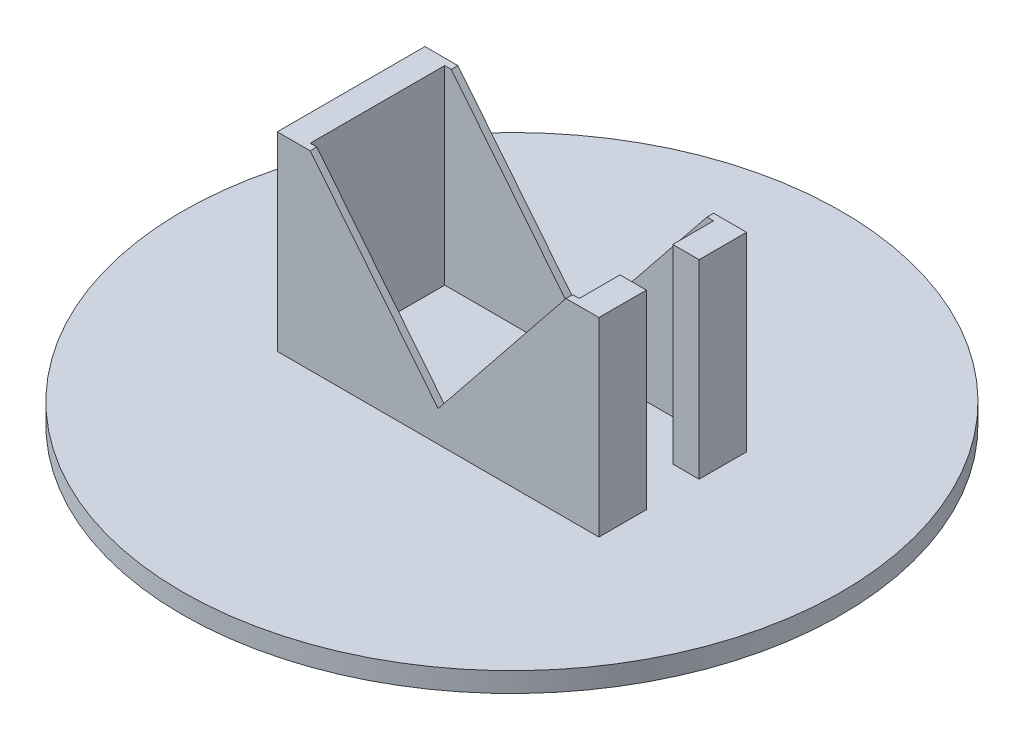
ISO-10303-21;
HEADER;
FILE_DESCRIPTION(('STEP AP214'),'2;1');
FILE_NAME('part.step','',(''),(''),'','','');
FILE_SCHEMA(('AUTOMOTIVE_DESIGN { 1 0 10303 214 1 1 1 1 }'));
ENDSEC;
DATA;
#1=APPLICATION_CONTEXT('core data for automotive mechanical design processes');
#2=APPLICATION_PROTOCOL_DEFINITION('international standard','automotive_design',2000,#1);
#3=PRODUCT_CONTEXT('',#1,'mechanical');
#4=PRODUCT('Part','Part','',(#3));
#5=PRODUCT_RELATED_PRODUCT_CATEGORY('part','',(#4));
#6=PRODUCT_DEFINITION_FORMATION('','',#4);
#7=PRODUCT_DEFINITION_CONTEXT('part definition',#1,'design');
#8=PRODUCT_DEFINITION('design','',#6,#7);
#9=PRODUCT_DEFINITION_SHAPE('','',#8);
#10=(LENGTH_UNIT() NAMED_UNIT(*) SI_UNIT(.MILLI.,.METRE.));
#11=(NAMED_UNIT(*) PLANE_ANGLE_UNIT() SI_UNIT($,.RADIAN.));
#12=(NAMED_UNIT(*) SI_UNIT($,.STERADIAN.) SOLID_ANGLE_UNIT());
#13=UNCERTAINTY_MEASURE_WITH_UNIT(LENGTH_MEASURE(1.E-05),#10,'distance_accuracy_value','');
#14=(GEOMETRIC_REPRESENTATION_CONTEXT(3) GLOBAL_UNCERTAINTY_ASSIGNED_CONTEXT((#13)) GLOBAL_UNIT_ASSIGNED_CONTEXT((#10,
#11,#12)) REPRESENTATION_CONTEXT('',''));
#15=CARTESIAN_POINT('',(0.,0.,0.));
#16=DIRECTION('',(0.,0.,1.));
#17=DIRECTION('',(1.,0.,0.));
#18=AXIS2_PLACEMENT_3D('',#15,#16,#17);
#19=CARTESIAN_POINT('',(0.,31.85,0.));
#20=DIRECTION('',(0.,-1.,0.));
#21=DIRECTION('',(0.,0.,-1.));
#22=AXIS2_PLACEMENT_3D('',#19,#20,#21);
#23=PLANE('',#22);
#24=DIRECTION('',(-1.,0.,0.));
#25=VECTOR('',#24,1.);
#26=CARTESIAN_POINT('',(-20.4,31.85,10.2));
#27=LINE('',#26,#25);
#28=CARTESIAN_POINT('',(20.4,31.85,10.2));
#29=VERTEX_POINT('',#28);
#30=CARTESIAN_POINT('',(19.4,31.85,10.2));
#31=VERTEX_POINT('',#30);
#32=EDGE_CURVE('E201',#29,#31,#27,.T.);
#33=ORIENTED_EDGE('',*,*,#32,.T.);
#34=DIRECTION('',(0.,0.,1.));
#35=VECTOR('',#34,1.);
#36=CARTESIAN_POINT('',(19.4,31.85,0.));
#37=LINE('',#36,#35);
#38=CARTESIAN_POINT('',(19.4,31.85,11.2));
#39=VERTEX_POINT('',#38);
#40=EDGE_CURVE('E47',#31,#39,#37,.T.);
#41=ORIENTED_EDGE('',*,*,#40,.T.);
#42=DIRECTION('',(1.,0.,0.));
#43=VECTOR('',#42,1.);
#44=CARTESIAN_POINT('',(-24.4,31.85,11.2));
#45=LINE('',#44,#43);
#46=CARTESIAN_POINT('',(24.4,31.85,11.2));
#47=VERTEX_POINT('',#46);
#48=EDGE_CURVE('E190',#39,#47,#45,.T.);
#49=ORIENTED_EDGE('',*,*,#48,.T.);
#50=DIRECTION('',(0.,0.,-1.));
#51=VECTOR('',#50,1.);
#52=CARTESIAN_POINT('',(24.4,31.85,11.2));
#53=LINE('',#52,#51);
#54=CARTESIAN_POINT('',(24.4,31.85,4.));
#55=VERTEX_POINT('',#54);
#56=EDGE_CURVE('E189',#47,#55,#53,.T.);
#57=ORIENTED_EDGE('',*,*,#56,.T.);
#58=DIRECTION('',(-1.,0.,0.));
#59=VECTOR('',#58,1.);
#60=CARTESIAN_POINT('',(20.4,31.85,4.));
#61=LINE('',#60,#59);
#62=CARTESIAN_POINT('',(20.4,31.85,4.));
#63=VERTEX_POINT('',#62);
#64=EDGE_CURVE('E192',#55,#63,#61,.T.);
#65=ORIENTED_EDGE('',*,*,#64,.T.);
#66=DIRECTION('',(0.,0.,1.));
#67=VECTOR('',#66,1.);
#68=CARTESIAN_POINT('',(20.4,31.85,10.2));
#69=LINE('',#68,#67);
#70=EDGE_CURVE('E198',#63,#29,#69,.T.);
#71=ORIENTED_EDGE('',*,*,#70,.T.);
#72=EDGE_LOOP('',(#33,#41,#49,#57,#65,#71));
#73=FACE_BOUND('',#72,.T.);
#74=ADVANCED_FACE('F43',(#73),#23,.F.);
#75=DIRECTION('',(-1.,0.,0.));
#76=VECTOR('',#75,1.);
#77=CARTESIAN_POINT('',(-24.4,31.85,-11.2));
#78=LINE('',#77,#76);
#79=CARTESIAN_POINT('',(24.4,31.85,-11.2));
#80=VERTEX_POINT('',#79);
#81=CARTESIAN_POINT('',(19.4,31.85,-11.2));
#82=VERTEX_POINT('',#81);
#83=EDGE_CURVE('E284',#80,#82,#78,.T.);
#84=ORIENTED_EDGE('',*,*,#83,.T.);
#85=CARTESIAN_POINT('',(19.4,31.85,-10.2));
#86=VERTEX_POINT('',#85);
#87=EDGE_CURVE('E11',#82,#86,#37,.T.);
#88=ORIENTED_EDGE('',*,*,#87,.T.);
#89=DIRECTION('',(1.,0.,0.));
#90=VECTOR('',#89,1.);
#91=CARTESIAN_POINT('',(-20.4,31.85,-10.2));
#92=LINE('',#91,#90);
#93=CARTESIAN_POINT('',(20.4,31.85,-10.2));
#94=VERTEX_POINT('',#93);
#95=EDGE_CURVE('E206',#86,#94,#92,.T.);
#96=ORIENTED_EDGE('',*,*,#95,.T.);
#97=DIRECTION('',(0.,0.,1.));
#98=VECTOR('',#97,1.);
#99=CARTESIAN_POINT('',(20.4,31.85,-4.));
#100=LINE('',#99,#98);
#101=CARTESIAN_POINT('',(20.4,31.85,-4.));
#102=VERTEX_POINT('',#101);
#103=EDGE_CURVE('E238',#94,#102,#100,.T.);
#104=ORIENTED_EDGE('',*,*,#103,.T.);
#105=DIRECTION('',(1.,0.,0.));
#106=VECTOR('',#105,1.);
#107=CARTESIAN_POINT('',(20.4,31.85,-4.));
#108=LINE('',#107,#106);
#109=CARTESIAN_POINT('',(24.4,31.85,-4.));
#110=VERTEX_POINT('',#109);
#111=EDGE_CURVE('E287',#102,#110,#108,.T.);
#112=ORIENTED_EDGE('',*,*,#111,.T.);
#113=DIRECTION('',(0.,0.,-1.));
#114=VECTOR('',#113,1.);
#115=CARTESIAN_POINT('',(24.4,31.85,-4.));
#116=LINE('',#115,#114);
#117=EDGE_CURVE('E285',#110,#80,#116,.T.);
#118=ORIENTED_EDGE('',*,*,#117,.T.);
#119=EDGE_LOOP('',(#84,#88,#96,#104,#112,#118));
#120=FACE_BOUND('',#119,.T.);
#121=ADVANCED_FACE('F348',(#120),#23,.F.);
#122=CARTESIAN_POINT('',(0.,3.,0.));
#123=DIRECTION('',(0.,1.,0.));
#124=DIRECTION('',(0.,0.,1.));
#125=AXIS2_PLACEMENT_3D('',#122,#123,#124);
#126=PLANE('',#125);
#127=CARTESIAN_POINT('',(0.,3.,0.));
#128=DIRECTION('',(0.,1.,0.));
#129=DIRECTION('',(0.,0.,1.));
#130=AXIS2_PLACEMENT_3D('',#127,#128,#129);
#131=CIRCLE('',#130,50.);
#132=CARTESIAN_POINT('',(0.,3.,50.));
#133=VERTEX_POINT('',#132);
#134=EDGE_CURVE('E272',#133,#133,#131,.T.);
#135=ORIENTED_EDGE('',*,*,#134,.T.);
#136=EDGE_LOOP('',(#135));
#137=FACE_BOUND('',#136,.T.);
#138=DIRECTION('',(1.,0.,0.));
#139=VECTOR('',#138,1.);
#140=CARTESIAN_POINT('',(20.4,3.,-4.));
#141=LINE('',#140,#139);
#142=CARTESIAN_POINT('',(20.4,3.,-4.));
#143=VERTEX_POINT('',#142);
#144=CARTESIAN_POINT('',(24.4,3.,-4.));
#145=VERTEX_POINT('',#144);
#146=EDGE_CURVE('E214',#143,#145,#141,.T.);
#147=ORIENTED_EDGE('',*,*,#146,.F.);
#148=DIRECTION('',(0.,0.,1.));
#149=VECTOR('',#148,1.);
#150=CARTESIAN_POINT('',(20.4,3.,-4.));
#151=LINE('',#150,#149);
#152=CARTESIAN_POINT('',(20.4,3.,-10.2));
#153=VERTEX_POINT('',#152);
#154=EDGE_CURVE('E211',#153,#143,#151,.T.);
#155=ORIENTED_EDGE('',*,*,#154,.F.);
#156=DIRECTION('',(1.,0.,0.));
#157=VECTOR('',#156,1.);
#158=CARTESIAN_POINT('',(-20.4,3.,-10.2));
#159=LINE('',#158,#157);
#160=CARTESIAN_POINT('',(-20.4,3.,-10.2));
#161=VERTEX_POINT('',#160);
#162=EDGE_CURVE('E236',#161,#153,#159,.T.);
#163=ORIENTED_EDGE('',*,*,#162,.F.);
#164=DIRECTION('',(0.,0.,-1.));
#165=VECTOR('',#164,1.);
#166=CARTESIAN_POINT('',(-20.4,3.,10.2));
#167=LINE('',#166,#165);
#168=CARTESIAN_POINT('',(-20.4,3.,10.2));
#169=VERTEX_POINT('',#168);
#170=EDGE_CURVE('E233',#169,#161,#167,.T.);
#171=ORIENTED_EDGE('',*,*,#170,.F.);
#172=DIRECTION('',(-1.,0.,0.));
#173=VECTOR('',#172,1.);
#174=CARTESIAN_POINT('',(-20.4,3.,10.2));
#175=LINE('',#174,#173);
#176=CARTESIAN_POINT('',(20.4,3.,10.2));
#177=VERTEX_POINT('',#176);
#178=EDGE_CURVE('E231',#177,#169,#175,.T.);
#179=ORIENTED_EDGE('',*,*,#178,.F.);
#180=DIRECTION('',(0.,0.,1.));
#181=VECTOR('',#180,1.);
#182=CARTESIAN_POINT('',(20.4,3.,10.2));
#183=LINE('',#182,#181);
#184=CARTESIAN_POINT('',(20.4,3.,4.));
#185=VERTEX_POINT('',#184);
#186=EDGE_CURVE('E229',#185,#177,#183,.T.);
#187=ORIENTED_EDGE('',*,*,#186,.F.);
#188=DIRECTION('',(-1.,0.,0.));
#189=VECTOR('',#188,1.);
#190=CARTESIAN_POINT('',(20.4,3.,4.));
#191=LINE('',#190,#189);
#192=CARTESIAN_POINT('',(24.4,3.,4.));
#193=VERTEX_POINT('',#192);
#194=EDGE_CURVE('E227',#193,#185,#191,.T.);
#195=ORIENTED_EDGE('',*,*,#194,.F.);
#196=DIRECTION('',(0.,0.,-1.));
#197=VECTOR('',#196,1.);
#198=CARTESIAN_POINT('',(24.4,3.,11.2));
#199=LINE('',#198,#197);
#200=CARTESIAN_POINT('',(24.4,3.,11.2));
#201=VERTEX_POINT('',#200);
#202=EDGE_CURVE('E225',#201,#193,#199,.T.);
#203=ORIENTED_EDGE('',*,*,#202,.F.);
#204=DIRECTION('',(1.,0.,0.));
#205=VECTOR('',#204,1.);
#206=CARTESIAN_POINT('',(-24.4,3.,11.2));
#207=LINE('',#206,#205);
#208=CARTESIAN_POINT('',(-24.4,3.,11.2));
#209=VERTEX_POINT('',#208);
#210=EDGE_CURVE('E223',#209,#201,#207,.T.);
#211=ORIENTED_EDGE('',*,*,#210,.F.);
#212=DIRECTION('',(0.,0.,1.));
#213=VECTOR('',#212,1.);
#214=CARTESIAN_POINT('',(-24.4,3.,11.2));
#215=LINE('',#214,#213);
#216=CARTESIAN_POINT('',(-24.4,3.,-11.2));
#217=VERTEX_POINT('',#216);
#218=EDGE_CURVE('E221',#217,#209,#215,.T.);
#219=ORIENTED_EDGE('',*,*,#218,.F.);
#220=DIRECTION('',(-1.,0.,0.));
#221=VECTOR('',#220,1.);
#222=CARTESIAN_POINT('',(-24.4,3.,-11.2));
#223=LINE('',#222,#221);
#224=CARTESIAN_POINT('',(24.4,3.,-11.2));
#225=VERTEX_POINT('',#224);
#226=EDGE_CURVE('E219',#225,#217,#223,.T.);
#227=ORIENTED_EDGE('',*,*,#226,.F.);
#228=DIRECTION('',(0.,0.,-1.));
#229=VECTOR('',#228,1.);
#230=CARTESIAN_POINT('',(24.4,3.,-4.));
#231=LINE('',#230,#229);
#232=EDGE_CURVE('E217',#145,#225,#231,.T.);
#233=ORIENTED_EDGE('',*,*,#232,.F.);
#234=EDGE_LOOP('',(#147,#155,#163,#171,#179,#187,#195,#203,#211,#219,#227,#233));
#235=FACE_BOUND('',#234,.T.);
#236=ADVANCED_FACE('F359',(#137,#235),#126,.T.);
#237=CARTESIAN_POINT('',(0.,3.,0.));
#238=DIRECTION('',(0.,-1.,0.));
#239=DIRECTION('',(0.,0.,-1.));
#240=AXIS2_PLACEMENT_3D('',#237,#238,#239);
#241=CYLINDRICAL_SURFACE('',#240,50.);
#242=ORIENTED_EDGE('',*,*,#134,.F.);
#243=EDGE_LOOP('',(#242));
#244=FACE_BOUND('',#243,.T.);
#245=CARTESIAN_POINT('',(0.,0.,0.));
#246=DIRECTION('',(0.,1.,0.));
#247=DIRECTION('',(0.,0.,1.));
#248=AXIS2_PLACEMENT_3D('',#245,#246,#247);
#249=CIRCLE('',#248,50.);
#250=CARTESIAN_POINT('',(0.,0.,50.));
#251=VERTEX_POINT('',#250);
#252=EDGE_CURVE('E271',#251,#251,#249,.T.);
#253=ORIENTED_EDGE('',*,*,#252,.T.);
#254=EDGE_LOOP('',(#253));
#255=FACE_BOUND('',#254,.T.);
#256=ADVANCED_FACE('F45',(#244,#255),#241,.T.);
#257=CARTESIAN_POINT('',(0.,0.,0.));
#258=DIRECTION('',(0.,1.,0.));
#259=DIRECTION('',(0.,0.,1.));
#260=AXIS2_PLACEMENT_3D('',#257,#258,#259);
#261=PLANE('',#260);
#262=ORIENTED_EDGE('',*,*,#252,.F.);
#263=EDGE_LOOP('',(#262));
#264=FACE_BOUND('',#263,.T.);
#265=ADVANCED_FACE('F504',(#264),#261,.F.);
#266=CARTESIAN_POINT('',(20.4,31.85,-4.));
#267=DIRECTION('',(1.,0.,0.));
#268=DIRECTION('',(0.,0.,-1.));
#269=AXIS2_PLACEMENT_3D('',#266,#267,#268);
#270=PLANE('',#269);
#271=ORIENTED_EDGE('',*,*,#154,.T.);
#272=DIRECTION('',(0.,-1.,0.));
#273=VECTOR('',#272,1.);
#274=CARTESIAN_POINT('',(20.4,31.85,-4.));
#275=LINE('',#274,#273);
#276=EDGE_CURVE('E269',#102,#143,#275,.T.);
#277=ORIENTED_EDGE('',*,*,#276,.F.);
#278=ORIENTED_EDGE('',*,*,#103,.F.);
#279=DIRECTION('',(0.,-1.,0.));
#280=VECTOR('',#279,1.);
#281=CARTESIAN_POINT('',(20.4,31.85,-10.2));
#282=LINE('',#281,#280);
#283=EDGE_CURVE('E210',#94,#153,#282,.T.);
#284=ORIENTED_EDGE('',*,*,#283,.T.);
#285=EDGE_LOOP('',(#271,#277,#278,#284));
#286=FACE_BOUND('',#285,.T.);
#287=ADVANCED_FACE('F495',(#286),#270,.F.);
#288=CARTESIAN_POINT('',(20.4,31.85,-4.));
#289=DIRECTION('',(0.,0.,-1.));
#290=DIRECTION('',(-1.,0.,0.));
#291=AXIS2_PLACEMENT_3D('',#288,#289,#290);
#292=PLANE('',#291);
#293=ORIENTED_EDGE('',*,*,#146,.T.);
#294=DIRECTION('',(0.,-1.,0.));
#295=VECTOR('',#294,1.);
#296=CARTESIAN_POINT('',(24.4,31.85,-4.));
#297=LINE('',#296,#295);
#298=EDGE_CURVE('E266',#110,#145,#297,.T.);
#299=ORIENTED_EDGE('',*,*,#298,.F.);
#300=ORIENTED_EDGE('',*,*,#111,.F.);
#301=ORIENTED_EDGE('',*,*,#276,.T.);
#302=EDGE_LOOP('',(#293,#299,#300,#301));
#303=FACE_BOUND('',#302,.T.);
#304=ADVANCED_FACE('F487',(#303),#292,.F.);
#305=CARTESIAN_POINT('',(24.4,31.85,-4.));
#306=DIRECTION('',(-1.,0.,0.));
#307=DIRECTION('',(0.,0.,1.));
#308=AXIS2_PLACEMENT_3D('',#305,#306,#307);
#309=PLANE('',#308);
#310=ORIENTED_EDGE('',*,*,#232,.T.);
#311=DIRECTION('',(0.,-1.,0.));
#312=VECTOR('',#311,1.);
#313=CARTESIAN_POINT('',(24.4,31.85,-11.2));
#314=LINE('',#313,#312);
#315=EDGE_CURVE('E263',#80,#225,#314,.T.);
#316=ORIENTED_EDGE('',*,*,#315,.F.);
#317=ORIENTED_EDGE('',*,*,#117,.F.);
#318=ORIENTED_EDGE('',*,*,#298,.T.);
#319=EDGE_LOOP('',(#310,#316,#317,#318));
#320=FACE_BOUND('',#319,.T.);
#321=ADVANCED_FACE('F353',(#320),#309,.F.);
#322=CARTESIAN_POINT('',(-24.4,31.85,-11.2));
#323=DIRECTION('',(0.,0.,1.));
#324=DIRECTION('',(1.,0.,0.));
#325=AXIS2_PLACEMENT_3D('',#322,#323,#324);
#326=PLANE('',#325);
#327=DIRECTION('',(0.625972601501166,-0.779845050102815,0.));
#328=VECTOR('',#327,1.);
#329=CARTESIAN_POINT('',(-21.3592084891507,34.2908081739033,-11.2));
#330=LINE('',#329,#328);
#331=CARTESIAN_POINT('',(-19.4,31.85,-11.2));
#332=VERTEX_POINT('',#331);
#333=CARTESIAN_POINT('',(0.,7.681220191246,-11.2));
#334=VERTEX_POINT('',#333);
#335=EDGE_CURVE('E66',#332,#334,#330,.T.);
#336=ORIENTED_EDGE('',*,*,#335,.T.);
#337=DIRECTION('',(0.625972601501167,0.779845050102815,0.));
#338=VECTOR('',#337,1.);
#339=CARTESIAN_POINT('',(2.23733363503995,10.4685203966068,-11.2));
#340=LINE('',#339,#338);
#341=EDGE_CURVE('E215',#334,#82,#340,.T.);
#342=ORIENTED_EDGE('',*,*,#341,.T.);
#343=ORIENTED_EDGE('',*,*,#83,.F.);
#344=ORIENTED_EDGE('',*,*,#315,.T.);
#345=ORIENTED_EDGE('',*,*,#226,.T.);
#346=DIRECTION('',(0.,-1.,0.));
#347=VECTOR('',#346,1.);
#348=CARTESIAN_POINT('',(-24.4,31.85,-11.2));
#349=LINE('',#348,#347);
#350=CARTESIAN_POINT('',(-24.4,31.85,-11.2));
#351=VERTEX_POINT('',#350);
#352=EDGE_CURVE('E260',#351,#217,#349,.T.);
#353=ORIENTED_EDGE('',*,*,#352,.F.);
#354=EDGE_CURVE('E277',#332,#351,#78,.T.);
#355=ORIENTED_EDGE('',*,*,#354,.F.);
#356=EDGE_LOOP('',(#336,#342,#343,#344,#345,#353,#355));
#357=FACE_BOUND('',#356,.T.);
#358=ADVANCED_FACE('F282',(#357),#326,.F.);
#359=CARTESIAN_POINT('',(-24.4,31.85,11.2));
#360=DIRECTION('',(1.,0.,0.));
#361=DIRECTION('',(0.,0.,-1.));
#362=AXIS2_PLACEMENT_3D('',#359,#360,#361);
#363=PLANE('',#362);
#364=ORIENTED_EDGE('',*,*,#218,.T.);
#365=DIRECTION('',(0.,-1.,0.));
#366=VECTOR('',#365,1.);
#367=CARTESIAN_POINT('',(-24.4,31.85,11.2));
#368=LINE('',#367,#366);
#369=CARTESIAN_POINT('',(-24.4,31.85,11.2));
#370=VERTEX_POINT('',#369);
#371=EDGE_CURVE('E258',#370,#209,#368,.T.);
#372=ORIENTED_EDGE('',*,*,#371,.F.);
#373=DIRECTION('',(0.,0.,1.));
#374=VECTOR('',#373,1.);
#375=CARTESIAN_POINT('',(-24.4,31.85,11.2));
#376=LINE('',#375,#374);
#377=EDGE_CURVE('E187',#351,#370,#376,.T.);
#378=ORIENTED_EDGE('',*,*,#377,.F.);
#379=ORIENTED_EDGE('',*,*,#352,.T.);
#380=EDGE_LOOP('',(#364,#372,#378,#379));
#381=FACE_BOUND('',#380,.T.);
#382=ADVANCED_FACE('F361',(#381),#363,.F.);
#383=CARTESIAN_POINT('',(-24.4,31.85,11.2));
#384=DIRECTION('',(0.,0.,-1.));
#385=DIRECTION('',(-1.,0.,0.));
#386=AXIS2_PLACEMENT_3D('',#383,#384,#385);
#387=PLANE('',#386);
#388=ORIENTED_EDGE('',*,*,#48,.F.);
#389=DIRECTION('',(0.625972601501167,0.779845050102815,0.));
#390=VECTOR('',#389,1.);
#391=CARTESIAN_POINT('',(0.,7.681220191246,11.2));
#392=LINE('',#391,#390);
#393=CARTESIAN_POINT('',(0.,7.681220191246,11.2));
#394=VERTEX_POINT('',#393);
#395=EDGE_CURVE('E183',#394,#39,#392,.T.);
#396=ORIENTED_EDGE('',*,*,#395,.F.);
#397=DIRECTION('',(0.625972601501166,-0.779845050102815,0.));
#398=VECTOR('',#397,1.);
#399=CARTESIAN_POINT('',(-19.4,31.85,11.2));
#400=LINE('',#399,#398);
#401=CARTESIAN_POINT('',(-19.4,31.85,11.2));
#402=VERTEX_POINT('',#401);
#403=EDGE_CURVE('E171',#402,#394,#400,.T.);
#404=ORIENTED_EDGE('',*,*,#403,.F.);
#405=EDGE_CURVE('E182',#370,#402,#45,.T.);
#406=ORIENTED_EDGE('',*,*,#405,.F.);
#407=ORIENTED_EDGE('',*,*,#371,.T.);
#408=ORIENTED_EDGE('',*,*,#210,.T.);
#409=DIRECTION('',(0.,-1.,0.));
#410=VECTOR('',#409,1.);
#411=CARTESIAN_POINT('',(24.4,31.85,11.2));
#412=LINE('',#411,#410);
#413=EDGE_CURVE('E255',#47,#201,#412,.T.);
#414=ORIENTED_EDGE('',*,*,#413,.F.);
#415=EDGE_LOOP('',(#388,#396,#404,#406,#407,#408,#414));
#416=FACE_BOUND('',#415,.T.);
#417=ADVANCED_FACE('F180',(#416),#387,.F.);
#418=CARTESIAN_POINT('',(24.4,31.85,11.2));
#419=DIRECTION('',(-1.,0.,0.));
#420=DIRECTION('',(0.,0.,1.));
#421=AXIS2_PLACEMENT_3D('',#418,#419,#420);
#422=PLANE('',#421);
#423=ORIENTED_EDGE('',*,*,#202,.T.);
#424=DIRECTION('',(0.,-1.,0.));
#425=VECTOR('',#424,1.);
#426=CARTESIAN_POINT('',(24.4,31.85,4.));
#427=LINE('',#426,#425);
#428=EDGE_CURVE('E252',#55,#193,#427,.T.);
#429=ORIENTED_EDGE('',*,*,#428,.F.);
#430=ORIENTED_EDGE('',*,*,#56,.F.);
#431=ORIENTED_EDGE('',*,*,#413,.T.);
#432=EDGE_LOOP('',(#423,#429,#430,#431));
#433=FACE_BOUND('',#432,.T.);
#434=ADVANCED_FACE('F318',(#433),#422,.F.);
#435=CARTESIAN_POINT('',(20.4,31.85,4.));
#436=DIRECTION('',(0.,0.,1.));
#437=DIRECTION('',(1.,0.,0.));
#438=AXIS2_PLACEMENT_3D('',#435,#436,#437);
#439=PLANE('',#438);
#440=ORIENTED_EDGE('',*,*,#194,.T.);
#441=DIRECTION('',(0.,-1.,0.));
#442=VECTOR('',#441,1.);
#443=CARTESIAN_POINT('',(20.4,31.85,4.));
#444=LINE('',#443,#442);
#445=EDGE_CURVE('E249',#63,#185,#444,.T.);
#446=ORIENTED_EDGE('',*,*,#445,.F.);
#447=ORIENTED_EDGE('',*,*,#64,.F.);
#448=ORIENTED_EDGE('',*,*,#428,.T.);
#449=EDGE_LOOP('',(#440,#446,#447,#448));
#450=FACE_BOUND('',#449,.T.);
#451=ADVANCED_FACE('F324',(#450),#439,.F.);
#452=CARTESIAN_POINT('',(20.4,31.85,10.2));
#453=DIRECTION('',(1.,0.,0.));
#454=DIRECTION('',(0.,0.,-1.));
#455=AXIS2_PLACEMENT_3D('',#452,#453,#454);
#456=PLANE('',#455);
#457=ORIENTED_EDGE('',*,*,#186,.T.);
#458=DIRECTION('',(0.,-1.,0.));
#459=VECTOR('',#458,1.);
#460=CARTESIAN_POINT('',(20.4,31.85,10.2));
#461=LINE('',#460,#459);
#462=EDGE_CURVE('E246',#29,#177,#461,.T.);
#463=ORIENTED_EDGE('',*,*,#462,.F.);
#464=ORIENTED_EDGE('',*,*,#70,.F.);
#465=ORIENTED_EDGE('',*,*,#445,.T.);
#466=EDGE_LOOP('',(#457,#463,#464,#465));
#467=FACE_BOUND('',#466,.T.);
#468=ADVANCED_FACE('F328',(#467),#456,.F.);
#469=CARTESIAN_POINT('',(-20.4,31.85,10.2));
#470=DIRECTION('',(0.,0.,1.));
#471=DIRECTION('',(1.,0.,0.));
#472=AXIS2_PLACEMENT_3D('',#469,#470,#471);
#473=PLANE('',#472);
#474=DIRECTION('',(0.625972601501166,-0.779845050102815,0.));
#475=VECTOR('',#474,1.);
#476=CARTESIAN_POINT('',(-19.7918416978301,32.3381616347807,10.2));
#477=LINE('',#476,#475);
#478=CARTESIAN_POINT('',(-19.4,31.85,10.2));
#479=VERTEX_POINT('',#478);
#480=CARTESIAN_POINT('',(0.,7.681220191246,10.2));
#481=VERTEX_POINT('',#480);
#482=EDGE_CURVE('E58',#479,#481,#477,.T.);
#483=ORIENTED_EDGE('',*,*,#482,.T.);
#484=DIRECTION('',(0.625972601501167,0.779845050102815,0.));
#485=VECTOR('',#484,1.);
#486=CARTESIAN_POINT('',(3.8047004263605,12.4211669357295,10.2));
#487=LINE('',#486,#485);
#488=EDGE_CURVE('E294',#481,#31,#487,.T.);
#489=ORIENTED_EDGE('',*,*,#488,.T.);
#490=ORIENTED_EDGE('',*,*,#32,.F.);
#491=ORIENTED_EDGE('',*,*,#462,.T.);
#492=ORIENTED_EDGE('',*,*,#178,.T.);
#493=DIRECTION('',(0.,-1.,0.));
#494=VECTOR('',#493,1.);
#495=CARTESIAN_POINT('',(-20.4,31.85,10.2));
#496=LINE('',#495,#494);
#497=CARTESIAN_POINT('',(-20.4,31.85,10.2));
#498=VERTEX_POINT('',#497);
#499=EDGE_CURVE('E243',#498,#169,#496,.T.);
#500=ORIENTED_EDGE('',*,*,#499,.F.);
#501=EDGE_CURVE('E200',#479,#498,#27,.T.);
#502=ORIENTED_EDGE('',*,*,#501,.F.);
#503=EDGE_LOOP('',(#483,#489,#490,#491,#492,#500,#502));
#504=FACE_BOUND('',#503,.T.);
#505=ADVANCED_FACE('F331',(#504),#473,.F.);
#506=CARTESIAN_POINT('',(-20.4,31.85,10.2));
#507=DIRECTION('',(-1.,0.,0.));
#508=DIRECTION('',(0.,0.,1.));
#509=AXIS2_PLACEMENT_3D('',#506,#507,#508);
#510=PLANE('',#509);
#511=ORIENTED_EDGE('',*,*,#170,.T.);
#512=DIRECTION('',(0.,-1.,0.));
#513=VECTOR('',#512,1.);
#514=CARTESIAN_POINT('',(-20.4,31.85,-10.2));
#515=LINE('',#514,#513);
#516=CARTESIAN_POINT('',(-20.4,31.85,-10.2));
#517=VERTEX_POINT('',#516);
#518=EDGE_CURVE('E241',#517,#161,#515,.T.);
#519=ORIENTED_EDGE('',*,*,#518,.F.);
#520=DIRECTION('',(0.,0.,-1.));
#521=VECTOR('',#520,1.);
#522=CARTESIAN_POINT('',(-20.4,31.85,10.2));
#523=LINE('',#522,#521);
#524=EDGE_CURVE('E204',#498,#517,#523,.T.);
#525=ORIENTED_EDGE('',*,*,#524,.F.);
#526=ORIENTED_EDGE('',*,*,#499,.T.);
#527=EDGE_LOOP('',(#511,#519,#525,#526));
#528=FACE_BOUND('',#527,.T.);
#529=ADVANCED_FACE('F336',(#528),#510,.F.);
#530=CARTESIAN_POINT('',(-20.4,31.85,-10.2));
#531=DIRECTION('',(0.,0.,-1.));
#532=DIRECTION('',(-1.,0.,0.));
#533=AXIS2_PLACEMENT_3D('',#530,#531,#532);
#534=PLANE('',#533);
#535=ORIENTED_EDGE('',*,*,#95,.F.);
#536=DIRECTION('',(-0.625972601501167,-0.779845050102815,0.));
#537=VECTOR('',#536,1.);
#538=CARTESIAN_POINT('',(3.8047004263605,12.4211669357295,-10.2));
#539=LINE('',#538,#537);
#540=CARTESIAN_POINT('',(0.,7.681220191246,-10.2));
#541=VERTEX_POINT('',#540);
#542=EDGE_CURVE('E297',#86,#541,#539,.T.);
#543=ORIENTED_EDGE('',*,*,#542,.T.);
#544=DIRECTION('',(-0.625972601501166,0.779845050102815,0.));
#545=VECTOR('',#544,1.);
#546=CARTESIAN_POINT('',(-19.7918416978301,32.3381616347807,-10.2));
#547=LINE('',#546,#545);
#548=CARTESIAN_POINT('',(-19.4,31.85,-10.2));
#549=VERTEX_POINT('',#548);
#550=EDGE_CURVE('E302',#541,#549,#547,.T.);
#551=ORIENTED_EDGE('',*,*,#550,.T.);
#552=EDGE_CURVE('E207',#517,#549,#92,.T.);
#553=ORIENTED_EDGE('',*,*,#552,.F.);
#554=ORIENTED_EDGE('',*,*,#518,.T.);
#555=ORIENTED_EDGE('',*,*,#162,.T.);
#556=ORIENTED_EDGE('',*,*,#283,.F.);
#557=EDGE_LOOP('',(#535,#543,#551,#553,#554,#555,#556));
#558=FACE_BOUND('',#557,.T.);
#559=ADVANCED_FACE('F341',(#558),#534,.F.);
#560=ORIENTED_EDGE('',*,*,#405,.T.);
#561=DIRECTION('',(0.,0.,-1.));
#562=VECTOR('',#561,1.);
#563=CARTESIAN_POINT('',(-19.4,31.85,0.));
#564=LINE('',#563,#562);
#565=EDGE_CURVE('E168',#402,#479,#564,.T.);
#566=ORIENTED_EDGE('',*,*,#565,.T.);
#567=ORIENTED_EDGE('',*,*,#501,.T.);
#568=ORIENTED_EDGE('',*,*,#524,.T.);
#569=ORIENTED_EDGE('',*,*,#552,.T.);
#570=EDGE_CURVE('E176',#549,#332,#564,.T.);
#571=ORIENTED_EDGE('',*,*,#570,.T.);
#572=ORIENTED_EDGE('',*,*,#354,.T.);
#573=ORIENTED_EDGE('',*,*,#377,.T.);
#574=EDGE_LOOP('',(#560,#566,#567,#568,#569,#571,#572,#573));
#575=FACE_BOUND('',#574,.T.);
#576=ADVANCED_FACE('F185',(#575),#23,.F.);
#577=CARTESIAN_POINT('',(-19.4,31.85,-17.65));
#578=DIRECTION('',(-0.779845050102815,-0.625972601501166,0.));
#579=DIRECTION('',(0.625972601501166,-0.779845050102815,0.));
#580=AXIS2_PLACEMENT_3D('',#577,#578,#579);
#581=PLANE('',#580);
#582=ORIENTED_EDGE('',*,*,#570,.F.);
#583=ORIENTED_EDGE('',*,*,#550,.F.);
#584=DIRECTION('',(0.,0.,1.));
#585=VECTOR('',#584,1.);
#586=CARTESIAN_POINT('',(0.,7.681220191246,-17.65));
#587=LINE('',#586,#585);
#588=EDGE_CURVE('E304',#334,#541,#587,.T.);
#589=ORIENTED_EDGE('',*,*,#588,.F.);
#590=ORIENTED_EDGE('',*,*,#335,.F.);
#591=EDGE_LOOP('',(#582,#583,#589,#590));
#592=FACE_BOUND('',#591,.T.);
#593=ADVANCED_FACE('F343',(#592),#581,.F.);
#594=CARTESIAN_POINT('',(0.,7.681220191246,-17.65));
#595=DIRECTION('',(0.779845050102815,-0.625972601501167,0.));
#596=DIRECTION('',(0.625972601501167,0.779845050102815,0.));
#597=AXIS2_PLACEMENT_3D('',#594,#595,#596);
#598=PLANE('',#597);
#599=ORIENTED_EDGE('',*,*,#588,.T.);
#600=ORIENTED_EDGE('',*,*,#542,.F.);
#601=ORIENTED_EDGE('',*,*,#87,.F.);
#602=ORIENTED_EDGE('',*,*,#341,.F.);
#603=EDGE_LOOP('',(#599,#600,#601,#602));
#604=FACE_BOUND('',#603,.T.);
#605=ADVANCED_FACE('F345',(#604),#598,.F.);
#606=EDGE_CURVE('E305',#481,#394,#587,.T.);
#607=ORIENTED_EDGE('',*,*,#606,.T.);
#608=ORIENTED_EDGE('',*,*,#395,.T.);
#609=ORIENTED_EDGE('',*,*,#40,.F.);
#610=ORIENTED_EDGE('',*,*,#488,.F.);
#611=EDGE_LOOP('',(#607,#608,#609,#610));
#612=FACE_BOUND('',#611,.T.);
#613=ADVANCED_FACE('F309',(#612),#598,.F.);
#614=ORIENTED_EDGE('',*,*,#565,.F.);
#615=ORIENTED_EDGE('',*,*,#403,.T.);
#616=ORIENTED_EDGE('',*,*,#606,.F.);
#617=ORIENTED_EDGE('',*,*,#482,.F.);
#618=EDGE_LOOP('',(#614,#615,#616,#617));
#619=FACE_BOUND('',#618,.T.);
#620=ADVANCED_FACE('F170',(#619),#581,.F.);
#621=CLOSED_SHELL('',(#74,#121,#236,#256,#265,#287,#304,#321,#358,#382,#417,#434,#451,#468,#505,
#529,#559,#576,#593,#605,#613,#620));
#622=MANIFOLD_SOLID_BREP('B2',#621);
#623=ADVANCED_BREP_SHAPE_REPRESENTATION('',(#18,#622),#14);
#624=SHAPE_DEFINITION_REPRESENTATION(#9,#623);
ENDSEC;
END-ISO-10303-21;
